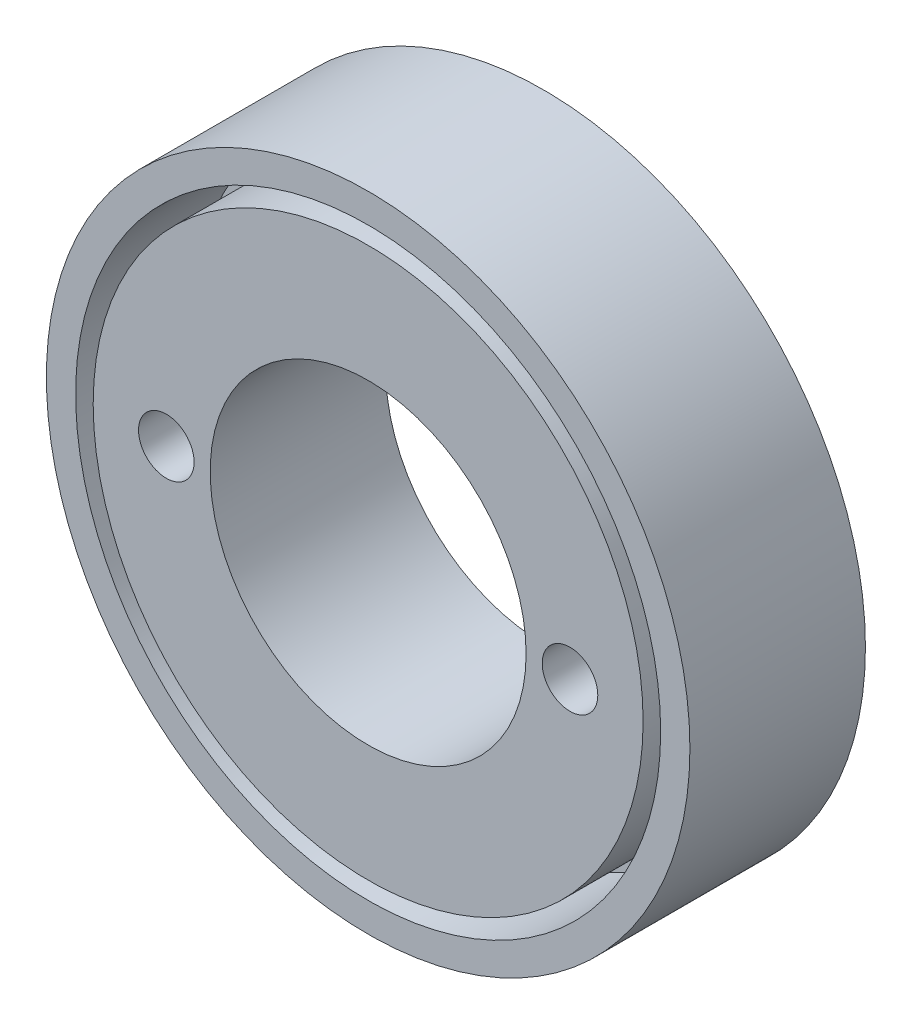
ISO-10303-21;
HEADER;
FILE_DESCRIPTION(('STEP AP214'),'2;1');
FILE_NAME('part.step','',(''),(''),'','','');
FILE_SCHEMA(('AUTOMOTIVE_DESIGN { 1 0 10303 214 1 1 1 1 }'));
ENDSEC;
DATA;
#1=APPLICATION_CONTEXT('core data for automotive mechanical design processes');
#2=APPLICATION_PROTOCOL_DEFINITION('international standard','automotive_design',2000,#1);
#3=PRODUCT_CONTEXT('',#1,'mechanical');
#4=PRODUCT('Part','Part','',(#3));
#5=PRODUCT_RELATED_PRODUCT_CATEGORY('part','',(#4));
#6=PRODUCT_DEFINITION_FORMATION('','',#4);
#7=PRODUCT_DEFINITION_CONTEXT('part definition',#1,'design');
#8=PRODUCT_DEFINITION('design','',#6,#7);
#9=PRODUCT_DEFINITION_SHAPE('','',#8);
#10=(LENGTH_UNIT() NAMED_UNIT(*) SI_UNIT(.MILLI.,.METRE.));
#11=(NAMED_UNIT(*) PLANE_ANGLE_UNIT() SI_UNIT($,.RADIAN.));
#12=(NAMED_UNIT(*) SI_UNIT($,.STERADIAN.) SOLID_ANGLE_UNIT());
#13=UNCERTAINTY_MEASURE_WITH_UNIT(LENGTH_MEASURE(1.E-05),#10,'distance_accuracy_value','');
#14=(GEOMETRIC_REPRESENTATION_CONTEXT(3) GLOBAL_UNCERTAINTY_ASSIGNED_CONTEXT((#13)) GLOBAL_UNIT_ASSIGNED_CONTEXT((#10,
#11,#12)) REPRESENTATION_CONTEXT('',''));
#15=CARTESIAN_POINT('',(0.,0.,0.));
#16=DIRECTION('',(0.,0.,1.));
#17=DIRECTION('',(1.,0.,0.));
#18=AXIS2_PLACEMENT_3D('',#15,#16,#17);
#19=CARTESIAN_POINT('',(0.,0.,10.));
#20=DIRECTION('',(0.,0.,1.));
#21=DIRECTION('',(1.,0.,0.));
#22=AXIS2_PLACEMENT_3D('',#19,#20,#21);
#23=PLANE('',#22);
#24=CARTESIAN_POINT('',(0.,0.,10.));
#25=DIRECTION('',(0.,0.,1.));
#26=DIRECTION('',(1.,0.,0.));
#27=AXIS2_PLACEMENT_3D('',#24,#25,#26);
#28=CIRCLE('',#27,50.);
#29=CARTESIAN_POINT('',(50.,0.,10.));
#30=VERTEX_POINT('',#29);
#31=EDGE_CURVE('E11',#30,#30,#28,.F.);
#32=ORIENTED_EDGE('',*,*,#31,.F.);
#33=EDGE_LOOP('',(#32));
#34=FACE_BOUND('',#33,.T.);
#35=CARTESIAN_POINT('',(0.,0.,10.));
#36=DIRECTION('',(0.,0.,1.));
#37=DIRECTION('',(1.,0.,0.));
#38=AXIS2_PLACEMENT_3D('',#35,#36,#37);
#39=CIRCLE('',#38,47.);
#40=CARTESIAN_POINT('',(47.,0.,10.));
#41=VERTEX_POINT('',#40);
#42=EDGE_CURVE('E55',#41,#41,#39,.T.);
#43=ORIENTED_EDGE('',*,*,#42,.F.);
#44=EDGE_LOOP('',(#43));
#45=FACE_BOUND('',#44,.T.);
#46=ADVANCED_FACE('F47',(#34,#45),#23,.T.);
#47=CARTESIAN_POINT('',(0.,0.,0.));
#48=DIRECTION('',(0.,0.,1.));
#49=DIRECTION('',(1.,0.,0.));
#50=AXIS2_PLACEMENT_3D('',#47,#48,#49);
#51=PLANE('',#50);
#52=CARTESIAN_POINT('',(0.,0.,0.));
#53=DIRECTION('',(0.,0.,1.));
#54=DIRECTION('',(1.,0.,0.));
#55=AXIS2_PLACEMENT_3D('',#52,#53,#54);
#56=CIRCLE('',#55,55.);
#57=CARTESIAN_POINT('',(55.,0.,0.));
#58=VERTEX_POINT('',#57);
#59=EDGE_CURVE('E66',#58,#58,#56,.T.);
#60=ORIENTED_EDGE('',*,*,#59,.F.);
#61=EDGE_LOOP('',(#60));
#62=FACE_BOUND('',#61,.T.);
#63=CARTESIAN_POINT('',(0.,0.,0.));
#64=DIRECTION('',(0.,0.,1.));
#65=DIRECTION('',(1.,0.,0.));
#66=AXIS2_PLACEMENT_3D('',#63,#64,#65);
#67=CIRCLE('',#66,27.);
#68=CARTESIAN_POINT('',(27.,0.,0.));
#69=VERTEX_POINT('',#68);
#70=EDGE_CURVE('E78',#69,#69,#67,.T.);
#71=ORIENTED_EDGE('',*,*,#70,.T.);
#72=EDGE_LOOP('',(#71));
#73=FACE_BOUND('',#72,.T.);
#74=ADVANCED_FACE('F87',(#62,#73),#51,.F.);
#75=CARTESIAN_POINT('',(0.,0.,10.));
#76=DIRECTION('',(0.,0.,-1.));
#77=DIRECTION('',(-1.,0.,0.));
#78=AXIS2_PLACEMENT_3D('',#75,#76,#77);
#79=CYLINDRICAL_SURFACE('',#78,55.);
#80=ORIENTED_EDGE('',*,*,#59,.T.);
#81=EDGE_LOOP('',(#80));
#82=FACE_BOUND('',#81,.T.);
#83=CARTESIAN_POINT('',(0.,0.,30.));
#84=DIRECTION('',(0.,0.,1.));
#85=DIRECTION('',(1.,0.,0.));
#86=AXIS2_PLACEMENT_3D('',#83,#84,#85);
#87=CIRCLE('',#86,55.);
#88=CARTESIAN_POINT('',(55.,0.,30.));
#89=VERTEX_POINT('',#88);
#90=EDGE_CURVE('E76',#89,#89,#87,.T.);
#91=ORIENTED_EDGE('',*,*,#90,.F.);
#92=EDGE_LOOP('',(#91));
#93=FACE_BOUND('',#92,.T.);
#94=ADVANCED_FACE('F49',(#82,#93),#79,.T.);
#95=CARTESIAN_POINT('',(0.,0.,10.));
#96=DIRECTION('',(0.,0.,-1.));
#97=DIRECTION('',(-1.,0.,0.));
#98=AXIS2_PLACEMENT_3D('',#95,#96,#97);
#99=CYLINDRICAL_SURFACE('',#98,27.);
#100=ORIENTED_EDGE('',*,*,#70,.F.);
#101=EDGE_LOOP('',(#100));
#102=FACE_BOUND('',#101,.T.);
#103=CARTESIAN_POINT('',(0.,0.,30.));
#104=DIRECTION('',(0.,0.,1.));
#105=DIRECTION('',(1.,0.,0.));
#106=AXIS2_PLACEMENT_3D('',#103,#104,#105);
#107=CIRCLE('',#106,27.);
#108=CARTESIAN_POINT('',(27.,0.,30.));
#109=VERTEX_POINT('',#108);
#110=EDGE_CURVE('E99',#109,#109,#107,.F.);
#111=ORIENTED_EDGE('',*,*,#110,.F.);
#112=EDGE_LOOP('',(#111));
#113=FACE_BOUND('',#112,.T.);
#114=ADVANCED_FACE('F92',(#102,#113),#99,.F.);
#115=CARTESIAN_POINT('',(-34.5,0.,30.));
#116=DIRECTION('',(0.,0.,-1.));
#117=DIRECTION('',(-1.,0.,0.));
#118=AXIS2_PLACEMENT_3D('',#115,#116,#117);
#119=CYLINDRICAL_SURFACE('',#118,4.75);
#120=CARTESIAN_POINT('',(-34.5,0.,30.));
#121=DIRECTION('',(0.,0.,1.));
#122=DIRECTION('',(1.,0.,0.));
#123=AXIS2_PLACEMENT_3D('',#120,#121,#122);
#124=CIRCLE('',#123,4.75);
#125=CARTESIAN_POINT('',(-29.75,0.,30.));
#126=VERTEX_POINT('',#125);
#127=EDGE_CURVE('E102',#126,#126,#124,.T.);
#128=ORIENTED_EDGE('',*,*,#127,.T.);
#129=EDGE_LOOP('',(#128));
#130=FACE_BOUND('',#129,.T.);
#131=CARTESIAN_POINT('',(-34.5,0.,10.));
#132=DIRECTION('',(0.,0.,1.));
#133=DIRECTION('',(1.,0.,0.));
#134=AXIS2_PLACEMENT_3D('',#131,#132,#133);
#135=CIRCLE('',#134,4.75);
#136=CARTESIAN_POINT('',(-29.75,0.,10.));
#137=VERTEX_POINT('',#136);
#138=EDGE_CURVE('E72',#137,#137,#135,.T.);
#139=ORIENTED_EDGE('',*,*,#138,.F.);
#140=EDGE_LOOP('',(#139));
#141=FACE_BOUND('',#140,.T.);
#142=ADVANCED_FACE('F95',(#130,#141),#119,.F.);
#143=CARTESIAN_POINT('',(0.,0.,30.));
#144=DIRECTION('',(0.,0.,-1.));
#145=DIRECTION('',(-1.,0.,0.));
#146=AXIS2_PLACEMENT_3D('',#143,#144,#145);
#147=CYLINDRICAL_SURFACE('',#146,47.);
#148=CARTESIAN_POINT('',(0.,0.,30.));
#149=DIRECTION('',(0.,0.,1.));
#150=DIRECTION('',(1.,0.,0.));
#151=AXIS2_PLACEMENT_3D('',#148,#149,#150);
#152=CIRCLE('',#151,47.);
#153=CARTESIAN_POINT('',(47.,0.,30.));
#154=VERTEX_POINT('',#153);
#155=EDGE_CURVE('E75',#154,#154,#152,.T.);
#156=ORIENTED_EDGE('',*,*,#155,.F.);
#157=EDGE_LOOP('',(#156));
#158=FACE_BOUND('',#157,.T.);
#159=ORIENTED_EDGE('',*,*,#42,.T.);
#160=EDGE_LOOP('',(#159));
#161=FACE_BOUND('',#160,.T.);
#162=ADVANCED_FACE('F148',(#158,#161),#147,.T.);
#163=CARTESIAN_POINT('',(34.5,0.,30.));
#164=DIRECTION('',(0.,0.,-1.));
#165=DIRECTION('',(-1.,0.,0.));
#166=AXIS2_PLACEMENT_3D('',#163,#164,#165);
#167=CYLINDRICAL_SURFACE('',#166,4.75);
#168=CARTESIAN_POINT('',(34.5,0.,30.));
#169=DIRECTION('',(0.,0.,1.));
#170=DIRECTION('',(1.,0.,0.));
#171=AXIS2_PLACEMENT_3D('',#168,#169,#170);
#172=CIRCLE('',#171,4.75);
#173=CARTESIAN_POINT('',(39.25,0.,30.));
#174=VERTEX_POINT('',#173);
#175=EDGE_CURVE('E70',#174,#174,#172,.F.);
#176=ORIENTED_EDGE('',*,*,#175,.F.);
#177=EDGE_LOOP('',(#176));
#178=FACE_BOUND('',#177,.T.);
#179=CARTESIAN_POINT('',(34.5,0.,10.));
#180=DIRECTION('',(0.,0.,1.));
#181=DIRECTION('',(1.,0.,0.));
#182=AXIS2_PLACEMENT_3D('',#179,#180,#181);
#183=CIRCLE('',#182,4.75);
#184=CARTESIAN_POINT('',(39.25,0.,10.));
#185=VERTEX_POINT('',#184);
#186=EDGE_CURVE('E60',#185,#185,#183,.F.);
#187=ORIENTED_EDGE('',*,*,#186,.T.);
#188=EDGE_LOOP('',(#187));
#189=FACE_BOUND('',#188,.T.);
#190=ADVANCED_FACE('F154',(#178,#189),#167,.F.);
#191=CARTESIAN_POINT('',(0.,0.,30.));
#192=DIRECTION('',(0.,0.,1.));
#193=DIRECTION('',(1.,0.,0.));
#194=AXIS2_PLACEMENT_3D('',#191,#192,#193);
#195=PLANE('',#194);
#196=ORIENTED_EDGE('',*,*,#155,.T.);
#197=EDGE_LOOP('',(#196));
#198=FACE_BOUND('',#197,.T.);
#199=ORIENTED_EDGE('',*,*,#110,.T.);
#200=EDGE_LOOP('',(#199));
#201=FACE_BOUND('',#200,.T.);
#202=ORIENTED_EDGE('',*,*,#127,.F.);
#203=EDGE_LOOP('',(#202));
#204=FACE_BOUND('',#203,.T.);
#205=ORIENTED_EDGE('',*,*,#175,.T.);
#206=EDGE_LOOP('',(#205));
#207=FACE_BOUND('',#206,.T.);
#208=ADVANCED_FACE('F137',(#198,#201,#204,#207),#195,.T.);
#209=ORIENTED_EDGE('',*,*,#186,.F.);
#210=EDGE_LOOP('',(#209));
#211=FACE_BOUND('',#210,.T.);
#212=ADVANCED_FACE('F131',(#211),#23,.T.);
#213=ORIENTED_EDGE('',*,*,#138,.T.);
#214=EDGE_LOOP('',(#213));
#215=FACE_BOUND('',#214,.T.);
#216=ADVANCED_FACE('F132',(#215),#23,.T.);
#217=CARTESIAN_POINT('',(0.,0.,30.));
#218=DIRECTION('',(0.,0.,-1.));
#219=DIRECTION('',(-1.,0.,0.));
#220=AXIS2_PLACEMENT_3D('',#217,#218,#219);
#221=CYLINDRICAL_SURFACE('',#220,50.);
#222=CARTESIAN_POINT('',(0.,0.,30.));
#223=DIRECTION('',(0.,0.,1.));
#224=DIRECTION('',(1.,0.,0.));
#225=AXIS2_PLACEMENT_3D('',#222,#223,#224);
#226=CIRCLE('',#225,50.);
#227=CARTESIAN_POINT('',(50.,0.,30.));
#228=VERTEX_POINT('',#227);
#229=EDGE_CURVE('E113',#228,#228,#226,.T.);
#230=ORIENTED_EDGE('',*,*,#229,.T.);
#231=EDGE_LOOP('',(#230));
#232=FACE_BOUND('',#231,.T.);
#233=ORIENTED_EDGE('',*,*,#31,.T.);
#234=EDGE_LOOP('',(#233));
#235=FACE_BOUND('',#234,.T.);
#236=ADVANCED_FACE('F118',(#232,#235),#221,.F.);
#237=CARTESIAN_POINT('',(0.,0.,30.));
#238=DIRECTION('',(0.,0.,1.));
#239=DIRECTION('',(1.,0.,0.));
#240=AXIS2_PLACEMENT_3D('',#237,#238,#239);
#241=PLANE('',#240);
#242=ORIENTED_EDGE('',*,*,#229,.F.);
#243=EDGE_LOOP('',(#242));
#244=FACE_BOUND('',#243,.T.);
#245=ORIENTED_EDGE('',*,*,#90,.T.);
#246=EDGE_LOOP('',(#245));
#247=FACE_BOUND('',#246,.T.);
#248=ADVANCED_FACE('F120',(#244,#247),#241,.T.);
#249=CLOSED_SHELL('',(#46,#74,#94,#114,#142,#162,#190,#208,#212,#216,#236,#248));
#250=MANIFOLD_SOLID_BREP('B2',#249);
#251=ADVANCED_BREP_SHAPE_REPRESENTATION('',(#18,#250),#14);
#252=SHAPE_DEFINITION_REPRESENTATION(#9,#251);
ENDSEC;
END-ISO-10303-21;
